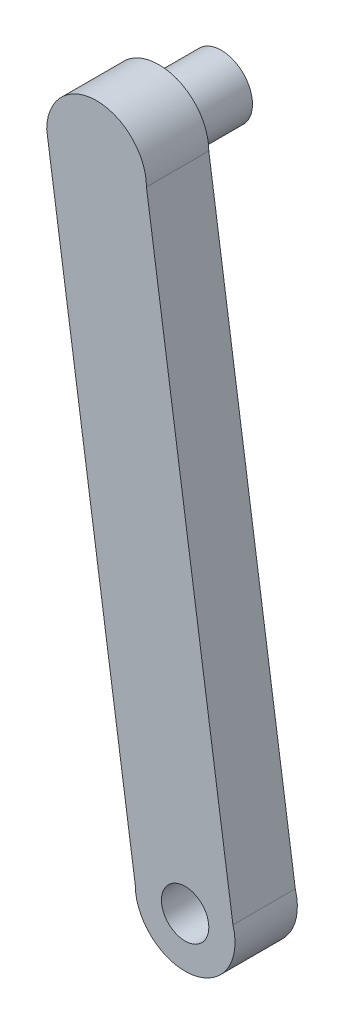
ISO-10303-21;
HEADER;
FILE_DESCRIPTION(('STEP AP214'),'2;1');
FILE_NAME('part.step','',(''),(''),'','','');
FILE_SCHEMA(('AUTOMOTIVE_DESIGN { 1 0 10303 214 1 1 1 1 }'));
ENDSEC;
DATA;
#1=APPLICATION_CONTEXT('core data for automotive mechanical design processes');
#2=APPLICATION_PROTOCOL_DEFINITION('international standard','automotive_design',2000,#1);
#3=PRODUCT_CONTEXT('',#1,'mechanical');
#4=PRODUCT('Part','Part','',(#3));
#5=PRODUCT_RELATED_PRODUCT_CATEGORY('part','',(#4));
#6=PRODUCT_DEFINITION_FORMATION('','',#4);
#7=PRODUCT_DEFINITION_CONTEXT('part definition',#1,'design');
#8=PRODUCT_DEFINITION('design','',#6,#7);
#9=PRODUCT_DEFINITION_SHAPE('','',#8);
#10=(LENGTH_UNIT() NAMED_UNIT(*) SI_UNIT(.MILLI.,.METRE.));
#11=(NAMED_UNIT(*) PLANE_ANGLE_UNIT() SI_UNIT($,.RADIAN.));
#12=(NAMED_UNIT(*) SI_UNIT($,.STERADIAN.) SOLID_ANGLE_UNIT());
#13=UNCERTAINTY_MEASURE_WITH_UNIT(LENGTH_MEASURE(1.E-05),#10,'distance_accuracy_value','');
#14=(GEOMETRIC_REPRESENTATION_CONTEXT(3) GLOBAL_UNCERTAINTY_ASSIGNED_CONTEXT((#13)) GLOBAL_UNIT_ASSIGNED_CONTEXT((#10,
#11,#12)) REPRESENTATION_CONTEXT('',''));
#15=CARTESIAN_POINT('',(0.,0.,0.));
#16=DIRECTION('',(0.,0.,1.));
#17=DIRECTION('',(1.,0.,0.));
#18=AXIS2_PLACEMENT_3D('',#15,#16,#17);
#19=CARTESIAN_POINT('',(17.1,0.,5.));
#20=DIRECTION('',(0.,0.,1.));
#21=DIRECTION('',(1.,0.,0.));
#22=AXIS2_PLACEMENT_3D('',#19,#20,#21);
#23=PLANE('',#22);
#24=CARTESIAN_POINT('',(17.1,0.,5.));
#25=DIRECTION('',(0.,0.,1.));
#26=DIRECTION('',(1.,0.,0.));
#27=AXIS2_PLACEMENT_3D('',#24,#25,#26);
#28=CIRCLE('',#27,4.);
#29=CARTESIAN_POINT('',(13.1,0.,5.));
#30=VERTEX_POINT('',#29);
#31=CARTESIAN_POINT('',(20.934913044898,1.13729588853169,5.));
#32=VERTEX_POINT('',#31);
#33=EDGE_CURVE('E94',#30,#32,#28,.T.);
#34=ORIENTED_EDGE('',*,*,#33,.T.);
#35=DIRECTION('',(-0.14365190352985,0.989628279007957,0.));
#36=VECTOR('',#35,1.);
#37=CARTESIAN_POINT('',(20.934913044898,1.13729588853169,5.));
#38=LINE('',#37,#36);
#39=CARTESIAN_POINT('',(14.,48.9124098484116,5.));
#40=VERTEX_POINT('',#39);
#41=EDGE_CURVE('E89',#32,#40,#38,.T.);
#42=ORIENTED_EDGE('',*,*,#41,.T.);
#43=CARTESIAN_POINT('',(9.99999999999998,48.9124098484116,5.));
#44=DIRECTION('',(0.,0.,1.));
#45=DIRECTION('',(1.,0.,0.));
#46=AXIS2_PLACEMENT_3D('',#43,#44,#45);
#47=CIRCLE('',#46,4.);
#48=CARTESIAN_POINT('',(5.99999999999999,48.9124098484116,5.));
#49=VERTEX_POINT('',#48);
#50=EDGE_CURVE('E92',#40,#49,#47,.T.);
#51=ORIENTED_EDGE('',*,*,#50,.T.);
#52=DIRECTION('',(0.14365190352985,-0.989628279007957,0.));
#53=VECTOR('',#52,1.);
#54=CARTESIAN_POINT('',(13.1,0.,5.));
#55=LINE('',#54,#53);
#56=EDGE_CURVE('E58',#49,#30,#55,.T.);
#57=ORIENTED_EDGE('',*,*,#56,.T.);
#58=EDGE_LOOP('',(#34,#42,#51,#57));
#59=FACE_BOUND('',#58,.T.);
#60=CARTESIAN_POINT('',(17.1,0.,5.));
#61=DIRECTION('',(0.,0.,1.));
#62=DIRECTION('',(1.,0.,0.));
#63=AXIS2_PLACEMENT_3D('',#60,#61,#62);
#64=CIRCLE('',#63,1.9);
#65=CARTESIAN_POINT('',(19.,0.,5.));
#66=VERTEX_POINT('',#65);
#67=EDGE_CURVE('E111',#66,#66,#64,.T.);
#68=ORIENTED_EDGE('',*,*,#67,.F.);
#69=EDGE_LOOP('',(#68));
#70=FACE_BOUND('',#69,.T.);
#71=ADVANCED_FACE('F41',(#59,#70),#23,.T.);
#72=CARTESIAN_POINT('',(17.1,0.,0.));
#73=DIRECTION('',(0.,0.,1.));
#74=DIRECTION('',(1.,0.,0.));
#75=AXIS2_PLACEMENT_3D('',#72,#73,#74);
#76=PLANE('',#75);
#77=CARTESIAN_POINT('',(9.99999999999998,48.9124098484116,0.));
#78=DIRECTION('',(0.,0.,1.));
#79=DIRECTION('',(1.,0.,0.));
#80=AXIS2_PLACEMENT_3D('',#77,#78,#79);
#81=CIRCLE('',#80,2.5);
#82=CARTESIAN_POINT('',(12.5,48.9124098484116,0.));
#83=VERTEX_POINT('',#82);
#84=EDGE_CURVE('E11',#83,#83,#81,.F.);
#85=ORIENTED_EDGE('',*,*,#84,.F.);
#86=EDGE_LOOP('',(#85));
#87=FACE_BOUND('',#86,.T.);
#88=CARTESIAN_POINT('',(17.1,0.,0.));
#89=DIRECTION('',(0.,0.,1.));
#90=DIRECTION('',(1.,0.,0.));
#91=AXIS2_PLACEMENT_3D('',#88,#89,#90);
#92=CIRCLE('',#91,4.);
#93=CARTESIAN_POINT('',(13.1,0.,0.));
#94=VERTEX_POINT('',#93);
#95=CARTESIAN_POINT('',(20.934913044898,1.13729588853169,0.));
#96=VERTEX_POINT('',#95);
#97=EDGE_CURVE('E108',#94,#96,#92,.T.);
#98=ORIENTED_EDGE('',*,*,#97,.F.);
#99=DIRECTION('',(0.14365190352985,-0.989628279007957,0.));
#100=VECTOR('',#99,1.);
#101=CARTESIAN_POINT('',(13.1,0.,0.));
#102=LINE('',#101,#100);
#103=CARTESIAN_POINT('',(5.99999999999999,48.9124098484116,0.));
#104=VERTEX_POINT('',#103);
#105=EDGE_CURVE('E81',#104,#94,#102,.T.);
#106=ORIENTED_EDGE('',*,*,#105,.F.);
#107=CARTESIAN_POINT('',(9.99999999999998,48.9124098484116,0.));
#108=DIRECTION('',(0.,0.,1.));
#109=DIRECTION('',(1.,0.,0.));
#110=AXIS2_PLACEMENT_3D('',#107,#108,#109);
#111=CIRCLE('',#110,4.);
#112=CARTESIAN_POINT('',(14.,48.9124098484116,0.));
#113=VERTEX_POINT('',#112);
#114=EDGE_CURVE('E75',#113,#104,#111,.T.);
#115=ORIENTED_EDGE('',*,*,#114,.F.);
#116=DIRECTION('',(-0.14365190352985,0.989628279007957,0.));
#117=VECTOR('',#116,1.);
#118=CARTESIAN_POINT('',(20.934913044898,1.13729588853169,0.));
#119=LINE('',#118,#117);
#120=EDGE_CURVE('E99',#96,#113,#119,.T.);
#121=ORIENTED_EDGE('',*,*,#120,.F.);
#122=EDGE_LOOP('',(#98,#106,#115,#121));
#123=FACE_BOUND('',#122,.T.);
#124=CARTESIAN_POINT('',(17.1,0.,0.));
#125=DIRECTION('',(0.,0.,1.));
#126=DIRECTION('',(1.,0.,0.));
#127=AXIS2_PLACEMENT_3D('',#124,#125,#126);
#128=CIRCLE('',#127,1.9);
#129=CARTESIAN_POINT('',(19.,0.,0.));
#130=VERTEX_POINT('',#129);
#131=EDGE_CURVE('E126',#130,#130,#128,.T.);
#132=ORIENTED_EDGE('',*,*,#131,.T.);
#133=EDGE_LOOP('',(#132));
#134=FACE_BOUND('',#133,.T.);
#135=ADVANCED_FACE('F119',(#87,#123,#134),#76,.F.);
#136=CARTESIAN_POINT('',(17.1,0.,5.));
#137=DIRECTION('',(0.,0.,-1.));
#138=DIRECTION('',(-1.,0.,0.));
#139=AXIS2_PLACEMENT_3D('',#136,#137,#138);
#140=CYLINDRICAL_SURFACE('',#139,4.);
#141=ORIENTED_EDGE('',*,*,#97,.T.);
#142=DIRECTION('',(0.,0.,-1.));
#143=VECTOR('',#142,1.);
#144=CARTESIAN_POINT('',(20.934913044898,1.13729588853169,5.));
#145=LINE('',#144,#143);
#146=EDGE_CURVE('E50',#32,#96,#145,.T.);
#147=ORIENTED_EDGE('',*,*,#146,.F.);
#148=ORIENTED_EDGE('',*,*,#33,.F.);
#149=DIRECTION('',(0.,0.,-1.));
#150=VECTOR('',#149,1.);
#151=CARTESIAN_POINT('',(13.1,0.,5.));
#152=LINE('',#151,#150);
#153=EDGE_CURVE('E104',#30,#94,#152,.T.);
#154=ORIENTED_EDGE('',*,*,#153,.T.);
#155=EDGE_LOOP('',(#141,#147,#148,#154));
#156=FACE_BOUND('',#155,.T.);
#157=ADVANCED_FACE('F43',(#156),#140,.T.);
#158=CARTESIAN_POINT('',(20.934913044898,1.13729588853169,5.));
#159=DIRECTION('',(-0.989628279007957,-0.14365190352985,0.));
#160=DIRECTION('',(0.14365190352985,-0.989628279007957,0.));
#161=AXIS2_PLACEMENT_3D('',#158,#159,#160);
#162=PLANE('',#161);
#163=ORIENTED_EDGE('',*,*,#120,.T.);
#164=DIRECTION('',(0.,0.,-1.));
#165=VECTOR('',#164,1.);
#166=CARTESIAN_POINT('',(14.,48.9124098484116,5.));
#167=LINE('',#166,#165);
#168=EDGE_CURVE('E97',#40,#113,#167,.T.);
#169=ORIENTED_EDGE('',*,*,#168,.F.);
#170=ORIENTED_EDGE('',*,*,#41,.F.);
#171=ORIENTED_EDGE('',*,*,#146,.T.);
#172=EDGE_LOOP('',(#163,#169,#170,#171));
#173=FACE_BOUND('',#172,.T.);
#174=ADVANCED_FACE('F98',(#173),#162,.F.);
#175=CARTESIAN_POINT('',(9.99999999999998,48.9124098484116,5.));
#176=DIRECTION('',(0.,0.,-1.));
#177=DIRECTION('',(-1.,0.,0.));
#178=AXIS2_PLACEMENT_3D('',#175,#176,#177);
#179=CYLINDRICAL_SURFACE('',#178,4.);
#180=ORIENTED_EDGE('',*,*,#114,.T.);
#181=DIRECTION('',(0.,0.,-1.));
#182=VECTOR('',#181,1.);
#183=CARTESIAN_POINT('',(5.99999999999999,48.9124098484116,5.));
#184=LINE('',#183,#182);
#185=EDGE_CURVE('E100',#49,#104,#184,.T.);
#186=ORIENTED_EDGE('',*,*,#185,.F.);
#187=ORIENTED_EDGE('',*,*,#50,.F.);
#188=ORIENTED_EDGE('',*,*,#168,.T.);
#189=EDGE_LOOP('',(#180,#186,#187,#188));
#190=FACE_BOUND('',#189,.T.);
#191=ADVANCED_FACE('F102',(#190),#179,.T.);
#192=CARTESIAN_POINT('',(13.1,0.,5.));
#193=DIRECTION('',(0.989628279007957,0.14365190352985,0.));
#194=DIRECTION('',(-0.14365190352985,0.989628279007957,0.));
#195=AXIS2_PLACEMENT_3D('',#192,#193,#194);
#196=PLANE('',#195);
#197=ORIENTED_EDGE('',*,*,#105,.T.);
#198=ORIENTED_EDGE('',*,*,#153,.F.);
#199=ORIENTED_EDGE('',*,*,#56,.F.);
#200=ORIENTED_EDGE('',*,*,#185,.T.);
#201=EDGE_LOOP('',(#197,#198,#199,#200));
#202=FACE_BOUND('',#201,.T.);
#203=ADVANCED_FACE('F149',(#202),#196,.F.);
#204=CARTESIAN_POINT('',(17.1,0.,5.));
#205=DIRECTION('',(0.,0.,-1.));
#206=DIRECTION('',(-1.,0.,0.));
#207=AXIS2_PLACEMENT_3D('',#204,#205,#206);
#208=CYLINDRICAL_SURFACE('',#207,1.9);
#209=ORIENTED_EDGE('',*,*,#67,.T.);
#210=EDGE_LOOP('',(#209));
#211=FACE_BOUND('',#210,.T.);
#212=ORIENTED_EDGE('',*,*,#131,.F.);
#213=EDGE_LOOP('',(#212));
#214=FACE_BOUND('',#213,.T.);
#215=ADVANCED_FACE('F141',(#211,#214),#208,.F.);
#216=CARTESIAN_POINT('',(9.99999999999998,48.9124098484116,-5.));
#217=DIRECTION('',(0.,0.,1.));
#218=DIRECTION('',(1.,0.,0.));
#219=AXIS2_PLACEMENT_3D('',#216,#217,#218);
#220=CYLINDRICAL_SURFACE('',#219,2.5);
#221=CARTESIAN_POINT('',(9.99999999999998,48.9124098484116,-5.));
#222=DIRECTION('',(0.,0.,-1.));
#223=DIRECTION('',(-1.,0.,0.));
#224=AXIS2_PLACEMENT_3D('',#221,#222,#223);
#225=CIRCLE('',#224,2.5);
#226=CARTESIAN_POINT('',(7.49999999999998,48.9124098484116,-5.));
#227=VERTEX_POINT('',#226);
#228=EDGE_CURVE('E128',#227,#227,#225,.T.);
#229=ORIENTED_EDGE('',*,*,#228,.F.);
#230=EDGE_LOOP('',(#229));
#231=FACE_BOUND('',#230,.T.);
#232=ORIENTED_EDGE('',*,*,#84,.T.);
#233=EDGE_LOOP('',(#232));
#234=FACE_BOUND('',#233,.T.);
#235=ADVANCED_FACE('F138',(#231,#234),#220,.T.);
#236=CARTESIAN_POINT('',(9.99999999999998,48.9124098484116,-5.));
#237=DIRECTION('',(0.,0.,-1.));
#238=DIRECTION('',(-1.,0.,0.));
#239=AXIS2_PLACEMENT_3D('',#236,#237,#238);
#240=PLANE('',#239);
#241=ORIENTED_EDGE('',*,*,#228,.T.);
#242=EDGE_LOOP('',(#241));
#243=FACE_BOUND('',#242,.T.);
#244=ADVANCED_FACE('F136',(#243),#240,.T.);
#245=CLOSED_SHELL('',(#71,#135,#157,#174,#191,#203,#215,#235,#244));
#246=MANIFOLD_SOLID_BREP('B2',#245);
#247=ADVANCED_BREP_SHAPE_REPRESENTATION('',(#18,#246),#14);
#248=SHAPE_DEFINITION_REPRESENTATION(#9,#247);
ENDSEC;
END-ISO-10303-21;
